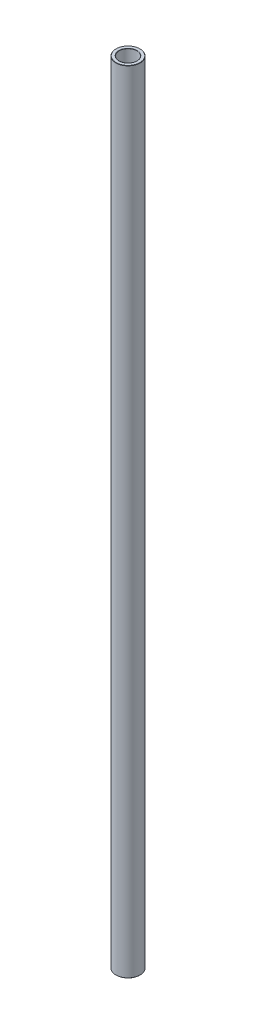
ISO-10303-21;
HEADER;
FILE_DESCRIPTION(('STEP AP214'),'2;1');
FILE_NAME('part.step','',(''),(''),'','','');
FILE_SCHEMA(('AUTOMOTIVE_DESIGN { 1 0 10303 214 1 1 1 1 }'));
ENDSEC;
DATA;
#1=APPLICATION_CONTEXT('core data for automotive mechanical design processes');
#2=APPLICATION_PROTOCOL_DEFINITION('international standard','automotive_design',2000,#1);
#3=PRODUCT_CONTEXT('',#1,'mechanical');
#4=PRODUCT('Part','Part','',(#3));
#5=PRODUCT_RELATED_PRODUCT_CATEGORY('part','',(#4));
#6=PRODUCT_DEFINITION_FORMATION('','',#4);
#7=PRODUCT_DEFINITION_CONTEXT('part definition',#1,'design');
#8=PRODUCT_DEFINITION('design','',#6,#7);
#9=PRODUCT_DEFINITION_SHAPE('','',#8);
#10=(LENGTH_UNIT() NAMED_UNIT(*) SI_UNIT(.MILLI.,.METRE.));
#11=(NAMED_UNIT(*) PLANE_ANGLE_UNIT() SI_UNIT($,.RADIAN.));
#12=(NAMED_UNIT(*) SI_UNIT($,.STERADIAN.) SOLID_ANGLE_UNIT());
#13=UNCERTAINTY_MEASURE_WITH_UNIT(LENGTH_MEASURE(1.E-05),#10,'distance_accuracy_value','');
#14=(GEOMETRIC_REPRESENTATION_CONTEXT(3) GLOBAL_UNCERTAINTY_ASSIGNED_CONTEXT((#13)) GLOBAL_UNIT_ASSIGNED_CONTEXT((#10,
#11,#12)) REPRESENTATION_CONTEXT('',''));
#15=CARTESIAN_POINT('',(0.,0.,0.));
#16=DIRECTION('',(0.,0.,1.));
#17=DIRECTION('',(1.,0.,0.));
#18=AXIS2_PLACEMENT_3D('',#15,#16,#17);
#19=CARTESIAN_POINT('',(0.,827.620000078,0.));
#20=DIRECTION('',(0.,1.,0.));
#21=DIRECTION('',(0.,0.,1.));
#22=AXIS2_PLACEMENT_3D('',#19,#20,#21);
#23=PLANE('',#22);
#24=CARTESIAN_POINT('',(0.,827.620000078,0.));
#25=DIRECTION('',(0.,1.,0.));
#26=DIRECTION('',(0.,0.,1.));
#27=AXIS2_PLACEMENT_3D('',#24,#25,#26);
#28=CIRCLE('',#27,9.525);
#29=CARTESIAN_POINT('',(0.,827.620000078,9.525));
#30=VERTEX_POINT('',#29);
#31=EDGE_CURVE('E11',#30,#30,#28,.F.);
#32=ORIENTED_EDGE('',*,*,#31,.T.);
#33=EDGE_LOOP('',(#32));
#34=FACE_BOUND('',#33,.T.);
#35=CARTESIAN_POINT('',(0.,827.620000078,0.));
#36=DIRECTION('',(0.,1.,0.));
#37=DIRECTION('',(0.,0.,1.));
#38=AXIS2_PLACEMENT_3D('',#35,#36,#37);
#39=CIRCLE('',#38,12.4460000000005);
#40=CARTESIAN_POINT('',(0.,827.620000078,12.4460000000005));
#41=VERTEX_POINT('',#40);
#42=EDGE_CURVE('E71',#41,#41,#39,.T.);
#43=ORIENTED_EDGE('',*,*,#42,.T.);
#44=EDGE_LOOP('',(#43));
#45=FACE_BOUND('',#44,.T.);
#46=ADVANCED_FACE('F51',(#34,#45),#23,.T.);
#47=CARTESIAN_POINT('',(0.,0.,0.));
#48=DIRECTION('',(0.,1.,0.));
#49=DIRECTION('',(0.,0.,1.));
#50=AXIS2_PLACEMENT_3D('',#47,#48,#49);
#51=PLANE('',#50);
#52=CARTESIAN_POINT('',(0.,0.,0.));
#53=DIRECTION('',(0.,1.,0.));
#54=DIRECTION('',(0.,0.,1.));
#55=AXIS2_PLACEMENT_3D('',#52,#53,#54);
#56=CIRCLE('',#55,9.525);
#57=CARTESIAN_POINT('',(0.,0.,9.525));
#58=VERTEX_POINT('',#57);
#59=EDGE_CURVE('E66',#58,#58,#56,.T.);
#60=ORIENTED_EDGE('',*,*,#59,.T.);
#61=EDGE_LOOP('',(#60));
#62=FACE_BOUND('',#61,.T.);
#63=CARTESIAN_POINT('',(0.,0.,0.));
#64=DIRECTION('',(0.,1.,0.));
#65=DIRECTION('',(0.,0.,1.));
#66=AXIS2_PLACEMENT_3D('',#63,#64,#65);
#67=CIRCLE('',#66,12.4459999999993);
#68=CARTESIAN_POINT('',(0.,0.,12.4459999999993));
#69=VERTEX_POINT('',#68);
#70=EDGE_CURVE('E74',#69,#69,#67,.F.);
#71=ORIENTED_EDGE('',*,*,#70,.T.);
#72=EDGE_LOOP('',(#71));
#73=FACE_BOUND('',#72,.T.);
#74=ADVANCED_FACE('F95',(#62,#73),#51,.F.);
#75=CARTESIAN_POINT('',(0.,827.620000078,0.));
#76=DIRECTION('',(0.,-1.,0.));
#77=DIRECTION('',(0.,0.,-1.));
#78=AXIS2_PLACEMENT_3D('',#75,#76,#77);
#79=CYLINDRICAL_SURFACE('',#78,12.7);
#80=CARTESIAN_POINT('',(0.,0.254000000000865,0.));
#81=DIRECTION('',(0.,1.,0.));
#82=DIRECTION('',(0.,0.,1.));
#83=AXIS2_PLACEMENT_3D('',#80,#81,#82);
#84=CIRCLE('',#83,12.7);
#85=CARTESIAN_POINT('',(0.,0.254000000000754,-12.7));
#86=VERTEX_POINT('',#85);
#87=EDGE_CURVE('E77',#86,#86,#84,.T.);
#88=CARTESIAN_POINT('',(0.,827.366000078,0.));
#89=DIRECTION('',(0.,1.,0.));
#90=DIRECTION('',(0.,0.,1.));
#91=AXIS2_PLACEMENT_3D('',#88,#89,#90);
#92=CIRCLE('',#91,12.7);
#93=CARTESIAN_POINT('',(0.,827.366000078,-12.7));
#94=VERTEX_POINT('',#93);
#95=EDGE_CURVE('E80',#94,#94,#92,.F.);
#96=CARTESIAN_POINT('',(0.,0.254000000000754,-12.7));
#97=CARTESIAN_POINT('',(0.,8.86975000081326,-12.7));
#98=CARTESIAN_POINT('',(0.,17.4855000016257,-12.7));
#99=CARTESIAN_POINT('',(0.,34.7170000032507,-12.7));
#100=CARTESIAN_POINT('',(0.,43.3327500040632,-12.7));
#101=CARTESIAN_POINT('',(0.,60.5642500056882,-12.7));
#102=CARTESIAN_POINT('',(0.,69.1800000065007,-12.7));
#103=CARTESIAN_POINT('',(0.,86.4115000081257,-12.7));
#104=CARTESIAN_POINT('',(0.,95.0272500089382,-12.7));
#105=CARTESIAN_POINT('',(0.,112.258750010563,-12.7));
#106=CARTESIAN_POINT('',(0.,120.874500011376,-12.7));
#107=CARTESIAN_POINT('',(0.,138.106000013001,-12.7));
#108=CARTESIAN_POINT('',(0.,146.721750013813,-12.7));
#109=CARTESIAN_POINT('',(0.,163.953250015438,-12.7));
#110=CARTESIAN_POINT('',(0.,172.569000016251,-12.7));
#111=CARTESIAN_POINT('',(0.,189.800500017876,-12.7));
#112=CARTESIAN_POINT('',(0.,198.416250018688,-12.7));
#113=CARTESIAN_POINT('',(0.,215.647750020313,-12.7));
#114=CARTESIAN_POINT('',(0.,224.263500021126,-12.7));
#115=CARTESIAN_POINT('',(0.,241.495000022751,-12.7));
#116=CARTESIAN_POINT('',(0.,250.110750023563,-12.7));
#117=CARTESIAN_POINT('',(0.,267.342250025188,-12.7));
#118=CARTESIAN_POINT('',(0.,275.958000026001,-12.7));
#119=CARTESIAN_POINT('',(0.,293.189500027626,-12.7));
#120=CARTESIAN_POINT('',(0.,301.805250028438,-12.7));
#121=CARTESIAN_POINT('',(0.,319.036750030063,-12.7));
#122=CARTESIAN_POINT('',(0.,327.652500030876,-12.7));
#123=CARTESIAN_POINT('',(0.,344.884000032501,-12.7));
#124=CARTESIAN_POINT('',(0.,353.499750033313,-12.7));
#125=CARTESIAN_POINT('',(0.,370.731250034938,-12.7));
#126=CARTESIAN_POINT('',(0.,379.347000035751,-12.7));
#127=CARTESIAN_POINT('',(0.,396.578500037375,-12.7));
#128=CARTESIAN_POINT('',(0.,405.194250038188,-12.7));
#129=CARTESIAN_POINT('',(0.,422.425750039813,-12.7));
#130=CARTESIAN_POINT('',(0.,431.041500040625,-12.7));
#131=CARTESIAN_POINT('',(0.,448.27300004225,-12.7));
#132=CARTESIAN_POINT('',(0.,456.888750043063,-12.7));
#133=CARTESIAN_POINT('',(0.,474.120250044688,-12.7));
#134=CARTESIAN_POINT('',(0.,482.7360000455,-12.7));
#135=CARTESIAN_POINT('',(0.,499.967500047125,-12.7));
#136=CARTESIAN_POINT('',(0.,508.583250047938,-12.7));
#137=CARTESIAN_POINT('',(0.,525.814750049563,-12.7));
#138=CARTESIAN_POINT('',(0.,534.430500050375,-12.7));
#139=CARTESIAN_POINT('',(0.,551.662000052,-12.7));
#140=CARTESIAN_POINT('',(0.,560.277750052813,-12.7));
#141=CARTESIAN_POINT('',(0.,577.509250054438,-12.7));
#142=CARTESIAN_POINT('',(0.,586.12500005525,-12.7));
#143=CARTESIAN_POINT('',(0.,603.356500056875,-12.7));
#144=CARTESIAN_POINT('',(0.,611.972250057688,-12.7));
#145=CARTESIAN_POINT('',(0.,629.203750059313,-12.7));
#146=CARTESIAN_POINT('',(0.,637.819500060125,-12.7));
#147=CARTESIAN_POINT('',(0.,655.05100006175,-12.7));
#148=CARTESIAN_POINT('',(0.,663.666750062563,-12.7));
#149=CARTESIAN_POINT('',(0.,680.898250064188,-12.7));
#150=CARTESIAN_POINT('',(0.,689.514000065,-12.7));
#151=CARTESIAN_POINT('',(0.,706.745500066625,-12.7));
#152=CARTESIAN_POINT('',(0.,715.361250067438,-12.7));
#153=CARTESIAN_POINT('',(0.,732.592750069063,-12.7));
#154=CARTESIAN_POINT('',(0.,741.208500069875,-12.7));
#155=CARTESIAN_POINT('',(0.,758.4400000715,-12.7));
#156=CARTESIAN_POINT('',(0.,767.055750072313,-12.7));
#157=CARTESIAN_POINT('',(0.,784.287250073938,-12.7));
#158=CARTESIAN_POINT('',(0.,792.90300007475,-12.7));
#159=CARTESIAN_POINT('',(0.,810.134500076375,-12.7));
#160=CARTESIAN_POINT('',(0.,818.750250077188,-12.7));
#161=CARTESIAN_POINT('',(0.,827.366000078,-12.7));
#162=B_SPLINE_CURVE_WITH_KNOTS('',3,(#96,#97,#98,#99,#100,#101,#102,#103,#104,#105,#106,#107,
#108,#109,#110,#111,#112,#113,#114,#115,#116,#117,#118,#119,#120,#121,#122,#123,#124,#125,#126,
#127,#128,#129,#130,#131,#132,#133,#134,#135,#136,#137,#138,#139,#140,#141,#142,#143,#144,#145,
#146,#147,#148,#149,#150,#151,#152,#153,#154,#155,#156,#157,#158,#159,#160,#161),.UNSPECIFIED.,
.F.,.F.,(4,2,2,2,2,2,2,2,2,2,2,2,2,2,2,2,2,2,2,2,2,2,2,2,2,2,2,2,2,2,2,2,4),(0.,
25.8472500024375,51.694500004875,77.5417500073124,103.38900000975,129.236250012187,
155.083500014625,180.930750017062,206.7780000195,232.625250021937,258.472500024375,
284.319750026812,310.16700002925,336.014250031687,361.861500034125,387.708750036562,
413.556000039,439.403250041437,465.250500043875,491.097750046312,516.94500004875,
542.792250051187,568.639500053625,594.486750056062,620.3340000585,646.181250060937,
672.028500063375,697.875750065812,723.72300006825,749.570250070687,775.417500073125,
801.264750075562,827.112000077999),.UNSPECIFIED.);
#163=EDGE_CURVE('BSEAM84',#86,#94,#162,.T.);
#164=ORIENTED_EDGE('',*,*,#87,.T.);
#165=ORIENTED_EDGE('',*,*,#95,.T.);
#166=ORIENTED_EDGE('',*,*,#163,.T.);
#167=ORIENTED_EDGE('',*,*,#163,.F.);
#168=EDGE_LOOP('',(#164,#166,#165,#167));
#169=FACE_BOUND('',#168,.T.);
#170=ADVANCED_FACE('F84',(#169),#79,.T.);
#171=CARTESIAN_POINT('',(0.,827.620000078,0.));
#172=DIRECTION('',(0.,-1.,0.));
#173=DIRECTION('',(0.,0.,-1.));
#174=AXIS2_PLACEMENT_3D('',#171,#172,#173);
#175=CYLINDRICAL_SURFACE('',#174,9.271);
#176=CARTESIAN_POINT('',(0.,0.253999999999976,0.));
#177=DIRECTION('',(0.,1.,0.));
#178=DIRECTION('',(0.,0.,1.));
#179=AXIS2_PLACEMENT_3D('',#176,#177,#178);
#180=CIRCLE('',#179,9.271);
#181=CARTESIAN_POINT('',(0.,0.253999999999865,-9.271));
#182=VERTEX_POINT('',#181);
#183=EDGE_CURVE('E58',#182,#182,#180,.F.);
#184=CARTESIAN_POINT('',(0.,827.366000078,0.));
#185=DIRECTION('',(0.,1.,0.));
#186=DIRECTION('',(0.,0.,1.));
#187=AXIS2_PLACEMENT_3D('',#184,#185,#186);
#188=CIRCLE('',#187,9.271);
#189=CARTESIAN_POINT('',(0.,827.366000078,-9.271));
#190=VERTEX_POINT('',#189);
#191=EDGE_CURVE('E62',#190,#190,#188,.T.);
#192=CARTESIAN_POINT('',(0.,0.253999999999865,-9.271));
#193=CARTESIAN_POINT('',(0.,8.86975000081238,-9.271));
#194=CARTESIAN_POINT('',(0.,17.4855000016249,-9.271));
#195=CARTESIAN_POINT('',(0.,34.7170000032498,-9.271));
#196=CARTESIAN_POINT('',(0.,43.3327500040623,-9.271));
#197=CARTESIAN_POINT('',(0.,60.5642500056874,-9.271));
#198=CARTESIAN_POINT('',(0.,69.1800000064999,-9.271));
#199=CARTESIAN_POINT('',(0.,86.4115000081249,-9.271));
#200=CARTESIAN_POINT('',(0.,95.0272500089374,-9.271));
#201=CARTESIAN_POINT('',(0.,112.258750010562,-9.271));
#202=CARTESIAN_POINT('',(0.,120.874500011375,-9.271));
#203=CARTESIAN_POINT('',(0.,138.106000013,-9.271));
#204=CARTESIAN_POINT('',(0.,146.721750013812,-9.271));
#205=CARTESIAN_POINT('',(0.,163.953250015437,-9.271));
#206=CARTESIAN_POINT('',(0.,172.56900001625,-9.271));
#207=CARTESIAN_POINT('',(0.,189.800500017875,-9.271));
#208=CARTESIAN_POINT('',(0.,198.416250018687,-9.271));
#209=CARTESIAN_POINT('',(0.,215.647750020312,-9.271));
#210=CARTESIAN_POINT('',(0.,224.263500021125,-9.271));
#211=CARTESIAN_POINT('',(0.,241.49500002275,-9.271));
#212=CARTESIAN_POINT('',(0.,250.110750023562,-9.271));
#213=CARTESIAN_POINT('',(0.,267.342250025187,-9.271));
#214=CARTESIAN_POINT('',(0.,275.958000026,-9.271));
#215=CARTESIAN_POINT('',(0.,293.189500027625,-9.271));
#216=CARTESIAN_POINT('',(0.,301.805250028437,-9.271));
#217=CARTESIAN_POINT('',(0.,319.036750030062,-9.271));
#218=CARTESIAN_POINT('',(0.,327.652500030875,-9.271));
#219=CARTESIAN_POINT('',(0.,344.8840000325,-9.271));
#220=CARTESIAN_POINT('',(0.,353.499750033312,-9.271));
#221=CARTESIAN_POINT('',(0.,370.731250034937,-9.271));
#222=CARTESIAN_POINT('',(0.,379.34700003575,-9.271));
#223=CARTESIAN_POINT('',(0.,396.578500037375,-9.271));
#224=CARTESIAN_POINT('',(0.,405.194250038187,-9.271));
#225=CARTESIAN_POINT('',(0.,422.425750039812,-9.271));
#226=CARTESIAN_POINT('',(0.,431.041500040625,-9.271));
#227=CARTESIAN_POINT('',(0.,448.27300004225,-9.271));
#228=CARTESIAN_POINT('',(0.,456.888750043062,-9.271));
#229=CARTESIAN_POINT('',(0.,474.120250044687,-9.271));
#230=CARTESIAN_POINT('',(0.,482.7360000455,-9.271));
#231=CARTESIAN_POINT('',(0.,499.967500047125,-9.271));
#232=CARTESIAN_POINT('',(0.,508.583250047937,-9.271));
#233=CARTESIAN_POINT('',(0.,525.814750049562,-9.271));
#234=CARTESIAN_POINT('',(0.,534.430500050375,-9.271));
#235=CARTESIAN_POINT('',(0.,551.662000052,-9.271));
#236=CARTESIAN_POINT('',(0.,560.277750052812,-9.271));
#237=CARTESIAN_POINT('',(0.,577.509250054437,-9.271));
#238=CARTESIAN_POINT('',(0.,586.12500005525,-9.271));
#239=CARTESIAN_POINT('',(0.,603.356500056875,-9.271));
#240=CARTESIAN_POINT('',(0.,611.972250057687,-9.271));
#241=CARTESIAN_POINT('',(0.,629.203750059312,-9.271));
#242=CARTESIAN_POINT('',(0.,637.819500060125,-9.271));
#243=CARTESIAN_POINT('',(0.,655.05100006175,-9.271));
#244=CARTESIAN_POINT('',(0.,663.666750062562,-9.271));
#245=CARTESIAN_POINT('',(0.,680.898250064187,-9.271));
#246=CARTESIAN_POINT('',(0.,689.514000065,-9.271));
#247=CARTESIAN_POINT('',(0.,706.745500066625,-9.271));
#248=CARTESIAN_POINT('',(0.,715.361250067437,-9.271));
#249=CARTESIAN_POINT('',(0.,732.592750069062,-9.271));
#250=CARTESIAN_POINT('',(0.,741.208500069875,-9.271));
#251=CARTESIAN_POINT('',(0.,758.4400000715,-9.271));
#252=CARTESIAN_POINT('',(0.,767.055750072312,-9.271));
#253=CARTESIAN_POINT('',(0.,784.287250073937,-9.271));
#254=CARTESIAN_POINT('',(0.,792.90300007475,-9.271));
#255=CARTESIAN_POINT('',(0.,810.134500076375,-9.271));
#256=CARTESIAN_POINT('',(0.,818.750250077187,-9.271));
#257=CARTESIAN_POINT('',(0.,827.366000078,-9.271));
#258=B_SPLINE_CURVE_WITH_KNOTS('',3,(#192,#193,#194,#195,#196,#197,#198,#199,#200,#201,#202,
#203,#204,#205,#206,#207,#208,#209,#210,#211,#212,#213,#214,#215,#216,#217,#218,#219,#220,#221,
#222,#223,#224,#225,#226,#227,#228,#229,#230,#231,#232,#233,#234,#235,#236,#237,#238,#239,#240,
#241,#242,#243,#244,#245,#246,#247,#248,#249,#250,#251,#252,#253,#254,#255,#256,#257),
.UNSPECIFIED.,.F.,.F.,(4,2,2,2,2,2,2,2,2,2,2,2,2,2,2,2,2,2,2,2,2,2,2,2,2,2,2,2,2,2,2,2,4),(0.,
25.8472500024375,51.694500004875,77.5417500073126,103.38900000975,129.236250012188,
155.083500014625,180.930750017062,206.7780000195,232.625250021937,258.472500024375,
284.319750026812,310.16700002925,336.014250031687,361.861500034125,387.708750036562,
413.556000039,439.403250041437,465.250500043875,491.097750046312,516.94500004875,
542.792250051187,568.639500053625,594.486750056062,620.3340000585,646.181250060937,
672.028500063375,697.875750065812,723.72300006825,749.570250070687,775.417500073125,
801.264750075562,827.112000078),.UNSPECIFIED.);
#259=EDGE_CURVE('BSEAM103',#182,#190,#258,.T.);
#260=ORIENTED_EDGE('',*,*,#183,.T.);
#261=ORIENTED_EDGE('',*,*,#191,.T.);
#262=ORIENTED_EDGE('',*,*,#259,.T.);
#263=ORIENTED_EDGE('',*,*,#259,.F.);
#264=EDGE_LOOP('',(#260,#262,#261,#263));
#265=FACE_BOUND('',#264,.T.);
#266=ADVANCED_FACE('F103',(#265),#175,.F.);
#267=CARTESIAN_POINT('',(0.,0.254000000000865,0.));
#268=DIRECTION('',(0.,1.,0.));
#269=DIRECTION('',(0.,0.,1.));
#270=AXIS2_PLACEMENT_3D('',#267,#268,#269);
#271=CONICAL_SURFACE('',#270,12.7,0.785398163397144);
#272=ORIENTED_EDGE('',*,*,#70,.F.);
#273=EDGE_LOOP('',(#272));
#274=FACE_BOUND('',#273,.T.);
#275=ORIENTED_EDGE('',*,*,#87,.F.);
#276=EDGE_LOOP('',(#275));
#277=FACE_BOUND('',#276,.T.);
#278=ADVANCED_FACE('F90',(#274,#277),#271,.T.);
#279=CARTESIAN_POINT('',(0.,827.620000078,0.));
#280=DIRECTION('',(0.,-1.,0.));
#281=DIRECTION('',(0.,0.,-1.));
#282=AXIS2_PLACEMENT_3D('',#279,#280,#281);
#283=CONICAL_SURFACE('',#282,12.4460000000005,0.785398163397363);
#284=ORIENTED_EDGE('',*,*,#95,.F.);
#285=EDGE_LOOP('',(#284));
#286=FACE_BOUND('',#285,.T.);
#287=ORIENTED_EDGE('',*,*,#42,.F.);
#288=EDGE_LOOP('',(#287));
#289=FACE_BOUND('',#288,.T.);
#290=ADVANCED_FACE('F86',(#286,#289),#283,.T.);
#291=CARTESIAN_POINT('',(0.,0.253999999999976,0.));
#292=DIRECTION('',(0.,1.,0.));
#293=DIRECTION('',(0.,0.,1.));
#294=AXIS2_PLACEMENT_3D('',#291,#292,#293);
#295=TOROIDAL_SURFACE('',#294,9.525,0.254);
#296=ORIENTED_EDGE('',*,*,#183,.F.);
#297=EDGE_LOOP('',(#296));
#298=FACE_BOUND('',#297,.T.);
#299=ORIENTED_EDGE('',*,*,#59,.F.);
#300=EDGE_LOOP('',(#299));
#301=FACE_BOUND('',#300,.T.);
#302=ADVANCED_FACE('F89',(#298,#301),#295,.T.);
#303=CARTESIAN_POINT('',(0.,827.366000078,0.));
#304=DIRECTION('',(0.,1.,0.));
#305=DIRECTION('',(0.,0.,1.));
#306=AXIS2_PLACEMENT_3D('',#303,#304,#305);
#307=TOROIDAL_SURFACE('',#306,9.525,0.254);
#308=ORIENTED_EDGE('',*,*,#31,.F.);
#309=EDGE_LOOP('',(#308));
#310=FACE_BOUND('',#309,.T.);
#311=ORIENTED_EDGE('',*,*,#191,.F.);
#312=EDGE_LOOP('',(#311));
#313=FACE_BOUND('',#312,.T.);
#314=ADVANCED_FACE('F53',(#310,#313),#307,.T.);
#315=CLOSED_SHELL('',(#46,#74,#170,#266,#278,#290,#302,#314));
#316=MANIFOLD_SOLID_BREP('B2',#315);
#317=ADVANCED_BREP_SHAPE_REPRESENTATION('',(#18,#316),#14);
#318=SHAPE_DEFINITION_REPRESENTATION(#9,#317);
ENDSEC;
END-ISO-10303-21;
